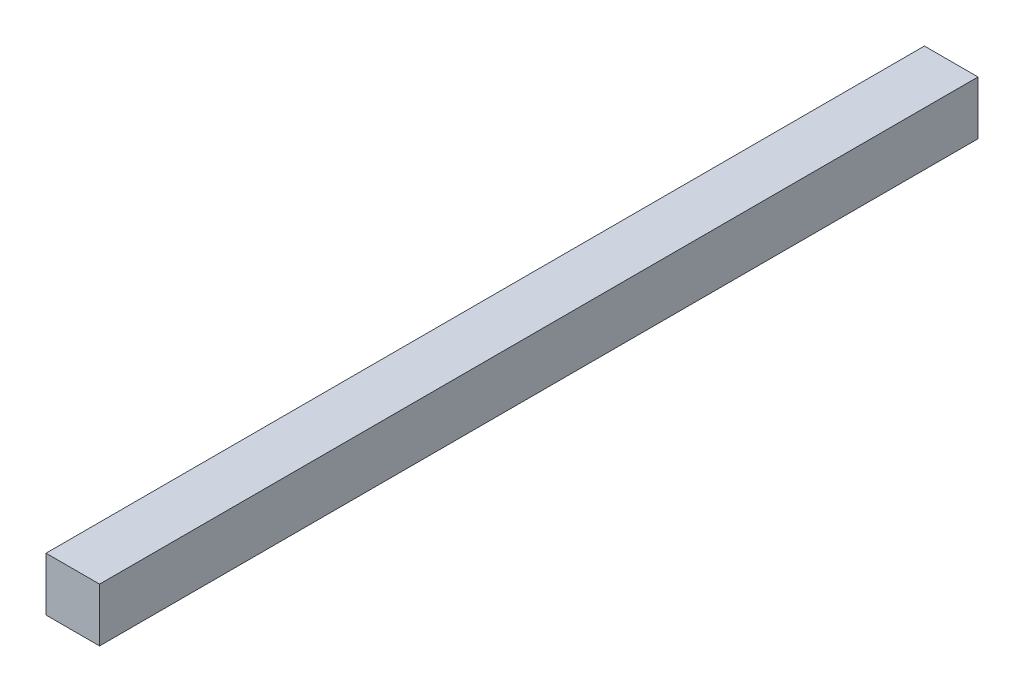
ISO-10303-21;
HEADER;
FILE_DESCRIPTION(('STEP AP214'),'2;1');
FILE_NAME('part.step','',(''),(''),'','','');
FILE_SCHEMA(('AUTOMOTIVE_DESIGN { 1 0 10303 214 1 1 1 1 }'));
ENDSEC;
DATA;
#1=APPLICATION_CONTEXT('core data for automotive mechanical design processes');
#2=APPLICATION_PROTOCOL_DEFINITION('international standard','automotive_design',2000,#1);
#3=PRODUCT_CONTEXT('',#1,'mechanical');
#4=PRODUCT('Part','Part','',(#3));
#5=PRODUCT_RELATED_PRODUCT_CATEGORY('part','',(#4));
#6=PRODUCT_DEFINITION_FORMATION('','',#4);
#7=PRODUCT_DEFINITION_CONTEXT('part definition',#1,'design');
#8=PRODUCT_DEFINITION('design','',#6,#7);
#9=PRODUCT_DEFINITION_SHAPE('','',#8);
#10=(LENGTH_UNIT() NAMED_UNIT(*) SI_UNIT(.MILLI.,.METRE.));
#11=(NAMED_UNIT(*) PLANE_ANGLE_UNIT() SI_UNIT($,.RADIAN.));
#12=(NAMED_UNIT(*) SI_UNIT($,.STERADIAN.) SOLID_ANGLE_UNIT());
#13=UNCERTAINTY_MEASURE_WITH_UNIT(LENGTH_MEASURE(1.E-05),#10,'distance_accuracy_value','');
#14=(GEOMETRIC_REPRESENTATION_CONTEXT(3) GLOBAL_UNCERTAINTY_ASSIGNED_CONTEXT((#13)) GLOBAL_UNIT_ASSIGNED_CONTEXT((#10,
#11,#12)) REPRESENTATION_CONTEXT('',''));
#15=CARTESIAN_POINT('',(0.,0.,0.));
#16=DIRECTION('',(0.,0.,1.));
#17=DIRECTION('',(1.,0.,0.));
#18=AXIS2_PLACEMENT_3D('',#15,#16,#17);
#19=CARTESIAN_POINT('',(0.,0.,164.));
#20=DIRECTION('',(1.,0.,0.));
#21=DIRECTION('',(0.,0.,-1.));
#22=AXIS2_PLACEMENT_3D('',#19,#20,#21);
#23=PLANE('',#22);
#24=DIRECTION('',(0.,-1.,0.));
#25=VECTOR('',#24,1.);
#26=CARTESIAN_POINT('',(0.,0.,0.));
#27=LINE('',#26,#25);
#28=CARTESIAN_POINT('',(0.,10.,0.));
#29=VERTEX_POINT('',#28);
#30=CARTESIAN_POINT('',(0.,0.,0.));
#31=VERTEX_POINT('',#30);
#32=EDGE_CURVE('E96',#29,#31,#27,.T.);
#33=ORIENTED_EDGE('',*,*,#32,.T.);
#34=DIRECTION('',(0.,0.,-1.));
#35=VECTOR('',#34,1.);
#36=CARTESIAN_POINT('',(0.,0.,164.));
#37=LINE('',#36,#35);
#38=CARTESIAN_POINT('',(0.,0.,164.));
#39=VERTEX_POINT('',#38);
#40=EDGE_CURVE('E11',#39,#31,#37,.T.);
#41=ORIENTED_EDGE('',*,*,#40,.F.);
#42=DIRECTION('',(0.,-1.,0.));
#43=VECTOR('',#42,1.);
#44=CARTESIAN_POINT('',(0.,0.,164.));
#45=LINE('',#44,#43);
#46=CARTESIAN_POINT('',(0.,10.,164.));
#47=VERTEX_POINT('',#46);
#48=EDGE_CURVE('E84',#47,#39,#45,.T.);
#49=ORIENTED_EDGE('',*,*,#48,.F.);
#50=DIRECTION('',(0.,0.,-1.));
#51=VECTOR('',#50,1.);
#52=CARTESIAN_POINT('',(0.,10.,164.));
#53=LINE('',#52,#51);
#54=EDGE_CURVE('E92',#47,#29,#53,.T.);
#55=ORIENTED_EDGE('',*,*,#54,.T.);
#56=EDGE_LOOP('',(#33,#41,#49,#55));
#57=FACE_BOUND('',#56,.T.);
#58=ADVANCED_FACE('F33',(#57),#23,.F.);
#59=CARTESIAN_POINT('',(0.,0.,164.));
#60=DIRECTION('',(0.,1.,0.));
#61=DIRECTION('',(0.,0.,1.));
#62=AXIS2_PLACEMENT_3D('',#59,#60,#61);
#63=PLANE('',#62);
#64=DIRECTION('',(1.,0.,0.));
#65=VECTOR('',#64,1.);
#66=CARTESIAN_POINT('',(0.,0.,0.));
#67=LINE('',#66,#65);
#68=CARTESIAN_POINT('',(10.,0.,0.));
#69=VERTEX_POINT('',#68);
#70=EDGE_CURVE('E88',#31,#69,#67,.T.);
#71=ORIENTED_EDGE('',*,*,#70,.T.);
#72=DIRECTION('',(0.,0.,-1.));
#73=VECTOR('',#72,1.);
#74=CARTESIAN_POINT('',(10.,0.,164.));
#75=LINE('',#74,#73);
#76=CARTESIAN_POINT('',(10.,0.,164.));
#77=VERTEX_POINT('',#76);
#78=EDGE_CURVE('E41',#77,#69,#75,.T.);
#79=ORIENTED_EDGE('',*,*,#78,.F.);
#80=DIRECTION('',(1.,0.,0.));
#81=VECTOR('',#80,1.);
#82=CARTESIAN_POINT('',(0.,0.,164.));
#83=LINE('',#82,#81);
#84=EDGE_CURVE('E79',#39,#77,#83,.T.);
#85=ORIENTED_EDGE('',*,*,#84,.F.);
#86=ORIENTED_EDGE('',*,*,#40,.T.);
#87=EDGE_LOOP('',(#71,#79,#85,#86));
#88=FACE_BOUND('',#87,.T.);
#89=ADVANCED_FACE('F87',(#88),#63,.F.);
#90=CARTESIAN_POINT('',(10.,0.,164.));
#91=DIRECTION('',(-1.,0.,0.));
#92=DIRECTION('',(0.,0.,1.));
#93=AXIS2_PLACEMENT_3D('',#90,#91,#92);
#94=PLANE('',#93);
#95=DIRECTION('',(0.,1.,0.));
#96=VECTOR('',#95,1.);
#97=CARTESIAN_POINT('',(10.,0.,0.));
#98=LINE('',#97,#96);
#99=CARTESIAN_POINT('',(10.,10.,0.));
#100=VERTEX_POINT('',#99);
#101=EDGE_CURVE('E66',#69,#100,#98,.T.);
#102=ORIENTED_EDGE('',*,*,#101,.T.);
#103=DIRECTION('',(0.,0.,-1.));
#104=VECTOR('',#103,1.);
#105=CARTESIAN_POINT('',(10.,10.,164.));
#106=LINE('',#105,#104);
#107=CARTESIAN_POINT('',(10.,10.,164.));
#108=VERTEX_POINT('',#107);
#109=EDGE_CURVE('E89',#108,#100,#106,.T.);
#110=ORIENTED_EDGE('',*,*,#109,.F.);
#111=DIRECTION('',(0.,1.,0.));
#112=VECTOR('',#111,1.);
#113=CARTESIAN_POINT('',(10.,0.,164.));
#114=LINE('',#113,#112);
#115=EDGE_CURVE('E82',#77,#108,#114,.T.);
#116=ORIENTED_EDGE('',*,*,#115,.F.);
#117=ORIENTED_EDGE('',*,*,#78,.T.);
#118=EDGE_LOOP('',(#102,#110,#116,#117));
#119=FACE_BOUND('',#118,.T.);
#120=ADVANCED_FACE('F90',(#119),#94,.F.);
#121=CARTESIAN_POINT('',(0.,10.,164.));
#122=DIRECTION('',(0.,-1.,0.));
#123=DIRECTION('',(0.,0.,-1.));
#124=AXIS2_PLACEMENT_3D('',#121,#122,#123);
#125=PLANE('',#124);
#126=DIRECTION('',(-1.,0.,0.));
#127=VECTOR('',#126,1.);
#128=CARTESIAN_POINT('',(0.,10.,0.));
#129=LINE('',#128,#127);
#130=EDGE_CURVE('E72',#100,#29,#129,.T.);
#131=ORIENTED_EDGE('',*,*,#130,.T.);
#132=ORIENTED_EDGE('',*,*,#54,.F.);
#133=DIRECTION('',(-1.,0.,0.));
#134=VECTOR('',#133,1.);
#135=CARTESIAN_POINT('',(0.,10.,164.));
#136=LINE('',#135,#134);
#137=EDGE_CURVE('E49',#108,#47,#136,.T.);
#138=ORIENTED_EDGE('',*,*,#137,.F.);
#139=ORIENTED_EDGE('',*,*,#109,.T.);
#140=EDGE_LOOP('',(#131,#132,#138,#139));
#141=FACE_BOUND('',#140,.T.);
#142=ADVANCED_FACE('F103',(#141),#125,.F.);
#143=CARTESIAN_POINT('',(0.,0.,164.));
#144=DIRECTION('',(0.,0.,-1.));
#145=DIRECTION('',(-1.,0.,0.));
#146=AXIS2_PLACEMENT_3D('',#143,#144,#145);
#147=PLANE('',#146);
#148=ORIENTED_EDGE('',*,*,#48,.T.);
#149=ORIENTED_EDGE('',*,*,#84,.T.);
#150=ORIENTED_EDGE('',*,*,#115,.T.);
#151=ORIENTED_EDGE('',*,*,#137,.T.);
#152=EDGE_LOOP('',(#148,#149,#150,#151));
#153=FACE_BOUND('',#152,.T.);
#154=ADVANCED_FACE('F80',(#153),#147,.F.);
#155=CARTESIAN_POINT('',(0.,0.,0.));
#156=DIRECTION('',(0.,0.,-1.));
#157=DIRECTION('',(-1.,0.,0.));
#158=AXIS2_PLACEMENT_3D('',#155,#156,#157);
#159=PLANE('',#158);
#160=ORIENTED_EDGE('',*,*,#32,.F.);
#161=ORIENTED_EDGE('',*,*,#130,.F.);
#162=ORIENTED_EDGE('',*,*,#101,.F.);
#163=ORIENTED_EDGE('',*,*,#70,.F.);
#164=EDGE_LOOP('',(#160,#161,#162,#163));
#165=FACE_BOUND('',#164,.T.);
#166=ADVANCED_FACE('F106',(#165),#159,.T.);
#167=CLOSED_SHELL('',(#58,#89,#120,#142,#154,#166));
#168=MANIFOLD_SOLID_BREP('B2',#167);
#169=ADVANCED_BREP_SHAPE_REPRESENTATION('',(#18,#168),#14);
#170=SHAPE_DEFINITION_REPRESENTATION(#9,#169);
ENDSEC;
END-ISO-10303-21;
